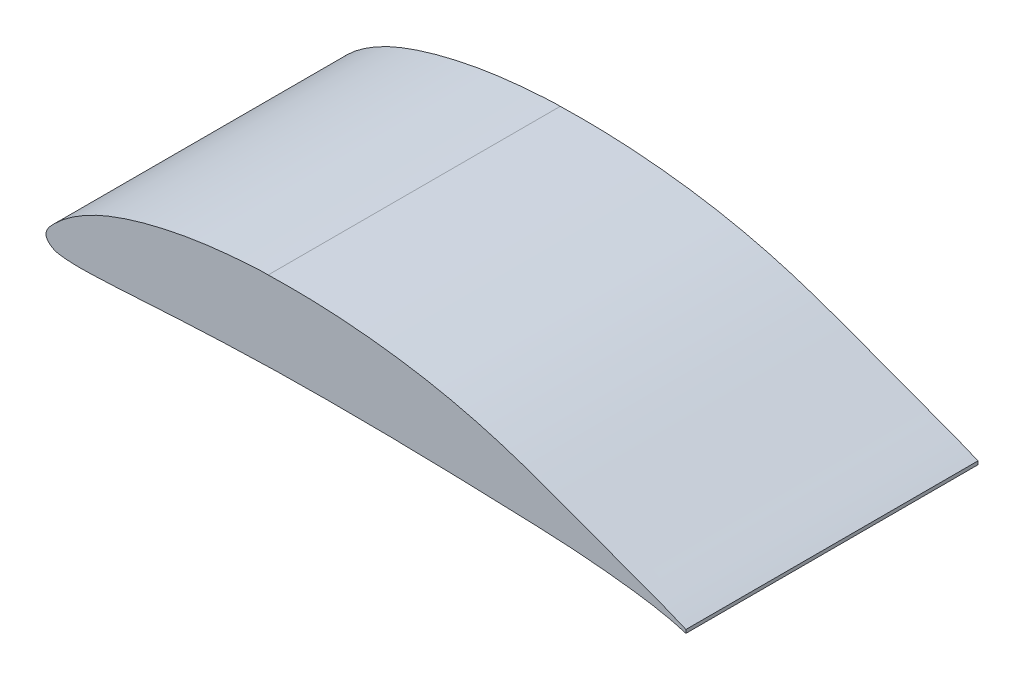
ISO-10303-21;
HEADER;
FILE_DESCRIPTION(('STEP AP214'),'2;1');
FILE_NAME('part.step','',(''),(''),'','','');
FILE_SCHEMA(('AUTOMOTIVE_DESIGN { 1 0 10303 214 1 1 1 1 }'));
ENDSEC;
DATA;
#1=APPLICATION_CONTEXT('core data for automotive mechanical design processes');
#2=APPLICATION_PROTOCOL_DEFINITION('international standard','automotive_design',2000,#1);
#3=PRODUCT_CONTEXT('',#1,'mechanical');
#4=PRODUCT('Part','Part','',(#3));
#5=PRODUCT_RELATED_PRODUCT_CATEGORY('part','',(#4));
#6=PRODUCT_DEFINITION_FORMATION('','',#4);
#7=PRODUCT_DEFINITION_CONTEXT('part definition',#1,'design');
#8=PRODUCT_DEFINITION('design','',#6,#7);
#9=PRODUCT_DEFINITION_SHAPE('','',#8);
#10=(LENGTH_UNIT() NAMED_UNIT(*) SI_UNIT(.MILLI.,.METRE.));
#11=(NAMED_UNIT(*) PLANE_ANGLE_UNIT() SI_UNIT($,.RADIAN.));
#12=(NAMED_UNIT(*) SI_UNIT($,.STERADIAN.) SOLID_ANGLE_UNIT());
#13=UNCERTAINTY_MEASURE_WITH_UNIT(LENGTH_MEASURE(1.E-05),#10,'distance_accuracy_value','');
#14=(GEOMETRIC_REPRESENTATION_CONTEXT(3) GLOBAL_UNCERTAINTY_ASSIGNED_CONTEXT((#13)) GLOBAL_UNIT_ASSIGNED_CONTEXT((#10,
#11,#12)) REPRESENTATION_CONTEXT('',''));
#15=CARTESIAN_POINT('',(0.,0.,0.));
#16=DIRECTION('',(0.,0.,1.));
#17=DIRECTION('',(1.,0.,0.));
#18=AXIS2_PLACEMENT_3D('',#15,#16,#17);
#19=CARTESIAN_POINT('',(286.055608227817,-67.2092663664544,200.));
#20=CARTESIAN_POINT('',(284.644285935263,-66.597802105307,200.));
#21=CARTESIAN_POINT('',(282.175461462593,-65.5472958097655,200.));
#22=CARTESIAN_POINT('',(278.640882202879,-64.0766875593889,200.));
#23=CARTESIAN_POINT('',(275.474642784893,-62.7903669886316,200.));
#24=CARTESIAN_POINT('',(272.312196320701,-61.5437830558965,200.));
#25=CARTESIAN_POINT('',(269.156931357705,-60.3293869088297,200.));
#26=CARTESIAN_POINT('',(265.993691800448,-59.1362769907856,200.));
#27=CARTESIAN_POINT('',(262.824387683554,-57.9585183599984,200.));
#28=CARTESIAN_POINT('',(259.650155279474,-56.7935152965214,200.));
#29=CARTESIAN_POINT('',(256.47438290546,-55.6309929065679,200.));
#30=CARTESIAN_POINT('',(252.239434164368,-54.0827408178304,200.));
#31=CARTESIAN_POINT('',(246.951126245529,-52.1365088385665,200.));
#32=CARTESIAN_POINT('',(240.614746747778,-49.7809726635527,200.));
#33=CARTESIAN_POINT('',(234.283971005091,-47.4153321021656,200.));
#34=CARTESIAN_POINT('',(227.956938485463,-45.0405089246866,200.));
#35=CARTESIAN_POINT('',(221.632362409549,-42.6583731375059,200.));
#36=CARTESIAN_POINT('',(215.306391481274,-40.2746014711487,200.));
#37=CARTESIAN_POINT('',(208.989812561505,-37.8948633020016,200.));
#38=CARTESIAN_POINT('',(202.681199965218,-35.5251997991141,200.));
#39=CARTESIAN_POINT('',(196.378289160986,-33.1767355859617,200.));
#40=CARTESIAN_POINT('',(190.065615765957,-30.8589499112433,200.));
#41=CARTESIAN_POINT('',(183.961366382459,-28.6583719657563,200.));
#42=CARTESIAN_POINT('',(179.560051762344,-27.1216651309627,200.));
#43=CARTESIAN_POINT('',(176.607497154977,-26.0993805224467,200.));
#44=CARTESIAN_POINT('',(174.25955443468,-25.311482978269,200.));
#45=CARTESIAN_POINT('',(170.186568217554,-23.9199734113576,200.));
#46=CARTESIAN_POINT('',(166.225838650053,-22.6238390862824,200.));
#47=CARTESIAN_POINT('',(161.874049685075,-21.2850022037015,200.));
#48=CARTESIAN_POINT('',(158.736648193296,-20.2914887778827,200.));
#49=CARTESIAN_POINT('',(155.066777623716,-19.2272658899611,200.));
#50=CARTESIAN_POINT('',(150.974926485595,-18.0060685962071,200.));
#51=CARTESIAN_POINT('',(145.688970990307,-16.544874514943,200.));
#52=CARTESIAN_POINT('',(139.327053916281,-14.8622977032051,200.));
#53=CARTESIAN_POINT('',(132.939676048903,-13.2769228113843,200.));
#54=CARTESIAN_POINT('',(126.529144262337,-11.7842649874989,200.));
#55=CARTESIAN_POINT('',(120.131390676028,-10.3952836219888,200.));
#56=CARTESIAN_POINT('',(113.749672511879,-9.10721305848849,200.));
#57=CARTESIAN_POINT('',(107.386282087973,-7.91870448799734,200.));
#58=CARTESIAN_POINT('',(101.007785918681,-6.82077320112415,200.));
#59=CARTESIAN_POINT('',(94.6155061161131,-5.80529502531891,200.));
#60=CARTESIAN_POINT('',(88.2098097487575,-4.87613039013865,200.));
#61=CARTESIAN_POINT('',(81.7918279452087,-4.02656267682369,200.));
#62=CARTESIAN_POINT('',(75.3763719719803,-3.25679609637486,200.));
#63=CARTESIAN_POINT('',(68.9655065698247,-2.56213242369687,200.));
#64=CARTESIAN_POINT('',(62.5611850692571,-1.94537518940381,200.));
#65=CARTESIAN_POINT('',(56.1516019302639,-1.40404015618211,200.));
#66=CARTESIAN_POINT('',(49.7366406368918,-0.939479238808299,200.));
#67=CARTESIAN_POINT('',(43.3162336950246,-0.553304168841471,200.));
#68=CARTESIAN_POINT('',(36.8904580676168,-0.244055134835146,200.));
#69=CARTESIAN_POINT('',(30.4574743318241,-0.0157190020213418,200.));
#70=CARTESIAN_POINT('',(24.0193314436082,0.134254503698745,200.));
#71=CARTESIAN_POINT('',(17.5775990832354,0.200126775617643,200.));
#72=CARTESIAN_POINT('',(9.57052206624604,0.186052888615887,200.));
#73=CARTESIAN_POINT('',(3.71239223157513,0.0371273343131518,200.));
#74=CARTESIAN_POINT('',(0.,0.,200.));
#75=B_SPLINE_CURVE_WITH_KNOTS('',3,(#19,#20,#21,#22,#23,#24,#25,#26,#27,#28,#29,#30,#31,#32,#33,
#34,#35,#36,#37,#38,#39,#40,#41,#42,#43,#44,#45,#46,#47,#48,#49,#50,#51,#52,#53,#54,#55,#56,#57,
#58,#59,#60,#61,#62,#63,#64,#65,#66,#67,#68,#69,#70,#71,#72,#73,#74),.UNSPECIFIED.,.F.,.F.,(4,1,
1,1,1,1,1,1,1,1,1,1,1,1,1,1,1,1,1,1,1,1,1,1,1,1,1,1,1,1,1,1,1,1,1,1,1,1,1,1,1,1,1,1,1,1,1,1,1,1,
1,1,1,4),(0.,0.0155663458478661,0.0271533790054014,0.0387444168495883,0.0501534358433827,
0.0615554571043646,0.0729607602409185,0.0843685956193895,0.0957736996847293,0.107181142492771,
0.118595016366418,0.14140830093972,0.164211232017684,0.187010579105938,0.209806491414266,
0.232606533582527,0.25540867608635,0.278223642013495,0.300920336848905,0.323611108079024,
0.346296668548033,0.368978321665873,0.389280515643663,0.393477088163527,0.400600192893842,
0.414344990295752,0.437037859688046,0.442772014887827,0.460424950904203,0.470341709035369,
0.481442265045974,0.503641346237949,0.525840621216428,0.548041443093927,0.57024389147018,
0.592452204863186,0.61429631720372,0.636130774921744,0.657964772913481,0.679797813110972,
0.701633713535334,0.723470751431021,0.745316507972413,0.767026058558757,0.788730770270634,
0.810430305061579,0.832124224706461,0.853822329490909,0.875524440048772,0.897230427447098,
0.918967255984546,0.940698023910348,0.962426571178589,1.),.UNSPECIFIED.);
#76=DIRECTION('',(0.,0.,-1.));
#77=VECTOR('',#76,1.);
#78=SURFACE_OF_LINEAR_EXTRUSION('',#75,#77);
#79=CARTESIAN_POINT('',(286.055608227817,-67.2092663664544,0.));
#80=CARTESIAN_POINT('',(284.644285935263,-66.597802105307,0.));
#81=CARTESIAN_POINT('',(282.175461462593,-65.5472958097655,0.));
#82=CARTESIAN_POINT('',(278.640882202879,-64.0766875593889,0.));
#83=CARTESIAN_POINT('',(275.474642784893,-62.7903669886316,0.));
#84=CARTESIAN_POINT('',(272.312196320701,-61.5437830558965,0.));
#85=CARTESIAN_POINT('',(269.156931357705,-60.3293869088297,0.));
#86=CARTESIAN_POINT('',(265.993691800448,-59.1362769907856,0.));
#87=CARTESIAN_POINT('',(262.824387683554,-57.9585183599984,0.));
#88=CARTESIAN_POINT('',(259.650155279474,-56.7935152965214,0.));
#89=CARTESIAN_POINT('',(256.47438290546,-55.6309929065679,0.));
#90=CARTESIAN_POINT('',(252.239434164368,-54.0827408178304,0.));
#91=CARTESIAN_POINT('',(246.951126245529,-52.1365088385665,0.));
#92=CARTESIAN_POINT('',(240.614746747778,-49.7809726635527,0.));
#93=CARTESIAN_POINT('',(234.283971005091,-47.4153321021656,0.));
#94=CARTESIAN_POINT('',(227.956938485463,-45.0405089246866,0.));
#95=CARTESIAN_POINT('',(221.632362409549,-42.6583731375059,0.));
#96=CARTESIAN_POINT('',(215.306391481274,-40.2746014711487,0.));
#97=CARTESIAN_POINT('',(208.989812561505,-37.8948633020016,0.));
#98=CARTESIAN_POINT('',(202.681199965218,-35.5251997991141,0.));
#99=CARTESIAN_POINT('',(196.378289160986,-33.1767355859617,0.));
#100=CARTESIAN_POINT('',(190.065615765957,-30.8589499112433,0.));
#101=CARTESIAN_POINT('',(183.961366382459,-28.6583719657563,0.));
#102=CARTESIAN_POINT('',(179.560051762344,-27.1216651309627,0.));
#103=CARTESIAN_POINT('',(176.607497154977,-26.0993805224467,0.));
#104=CARTESIAN_POINT('',(174.25955443468,-25.311482978269,0.));
#105=CARTESIAN_POINT('',(170.186568217554,-23.9199734113576,0.));
#106=CARTESIAN_POINT('',(166.225838650053,-22.6238390862824,0.));
#107=CARTESIAN_POINT('',(161.874049685075,-21.2850022037015,0.));
#108=CARTESIAN_POINT('',(158.736648193296,-20.2914887778827,0.));
#109=CARTESIAN_POINT('',(155.066777623716,-19.2272658899611,0.));
#110=CARTESIAN_POINT('',(150.974926485595,-18.0060685962071,0.));
#111=CARTESIAN_POINT('',(145.688970990307,-16.544874514943,0.));
#112=CARTESIAN_POINT('',(139.327053916281,-14.8622977032051,0.));
#113=CARTESIAN_POINT('',(132.939676048903,-13.2769228113843,0.));
#114=CARTESIAN_POINT('',(126.529144262337,-11.7842649874989,0.));
#115=CARTESIAN_POINT('',(120.131390676028,-10.3952836219888,0.));
#116=CARTESIAN_POINT('',(113.749672511879,-9.10721305848849,0.));
#117=CARTESIAN_POINT('',(107.386282087973,-7.91870448799734,0.));
#118=CARTESIAN_POINT('',(101.007785918681,-6.82077320112415,0.));
#119=CARTESIAN_POINT('',(94.6155061161131,-5.80529502531891,0.));
#120=CARTESIAN_POINT('',(88.2098097487575,-4.87613039013865,0.));
#121=CARTESIAN_POINT('',(81.7918279452087,-4.02656267682369,0.));
#122=CARTESIAN_POINT('',(75.3763719719803,-3.25679609637486,0.));
#123=CARTESIAN_POINT('',(68.9655065698247,-2.56213242369687,0.));
#124=CARTESIAN_POINT('',(62.5611850692571,-1.94537518940381,0.));
#125=CARTESIAN_POINT('',(56.1516019302639,-1.40404015618211,0.));
#126=CARTESIAN_POINT('',(49.7366406368918,-0.939479238808299,0.));
#127=CARTESIAN_POINT('',(43.3162336950246,-0.553304168841471,0.));
#128=CARTESIAN_POINT('',(36.8904580676168,-0.244055134835146,0.));
#129=CARTESIAN_POINT('',(30.4574743318241,-0.0157190020213418,0.));
#130=CARTESIAN_POINT('',(24.0193314436082,0.134254503698745,0.));
#131=CARTESIAN_POINT('',(17.5775990832354,0.200126775617643,0.));
#132=CARTESIAN_POINT('',(9.57052206624604,0.186052888615887,0.));
#133=CARTESIAN_POINT('',(3.71239223157513,0.0371273343131518,0.));
#134=CARTESIAN_POINT('',(0.,0.,0.));
#135=B_SPLINE_CURVE_WITH_KNOTS('',3,(#79,#80,#81,#82,#83,#84,#85,#86,#87,#88,#89,#90,#91,#92,
#93,#94,#95,#96,#97,#98,#99,#100,#101,#102,#103,#104,#105,#106,#107,#108,#109,#110,#111,#112,
#113,#114,#115,#116,#117,#118,#119,#120,#121,#122,#123,#124,#125,#126,#127,#128,#129,#130,#131,
#132,#133,#134),.UNSPECIFIED.,.F.,.F.,(4,1,1,1,1,1,1,1,1,1,1,1,1,1,1,1,1,1,1,1,1,1,1,1,1,1,1,1,
1,1,1,1,1,1,1,1,1,1,1,1,1,1,1,1,1,1,1,1,1,1,1,1,1,4),(0.,0.0155663458478661,0.0271533790054014,
0.0387444168495883,0.0501534358433827,0.0615554571043646,0.0729607602409185,0.0843685956193895,
0.0957736996847293,0.107181142492771,0.118595016366418,0.14140830093972,0.164211232017684,
0.187010579105938,0.209806491414266,0.232606533582527,0.25540867608635,0.278223642013495,
0.300920336848905,0.323611108079024,0.346296668548033,0.368978321665873,0.389280515643663,
0.393477088163527,0.400600192893842,0.414344990295752,0.437037859688046,0.442772014887827,
0.460424950904203,0.470341709035369,0.481442265045974,0.503641346237949,0.525840621216428,
0.548041443093927,0.57024389147018,0.592452204863186,0.61429631720372,0.636130774921744,
0.657964772913481,0.679797813110972,0.701633713535334,0.723470751431021,0.745316507972413,
0.767026058558757,0.788730770270634,0.810430305061579,0.832124224706461,0.853822329490909,
0.875524440048772,0.897230427447098,0.918967255984546,0.940698023910348,0.962426571178589,1.),.UNSPECIFIED.);
#136=CARTESIAN_POINT('',(286.055608227817,-67.2092663664544,0.));
#137=VERTEX_POINT('',#136);
#138=CARTESIAN_POINT('',(0.,0.,0.));
#139=VERTEX_POINT('',#138);
#140=EDGE_CURVE('E84',#137,#139,#135,.T.);
#141=ORIENTED_EDGE('',*,*,#140,.T.);
#142=DIRECTION('',(0.,0.,-1.));
#143=VECTOR('',#142,1.);
#144=CARTESIAN_POINT('',(0.,0.,200.));
#145=LINE('',#144,#143);
#146=CARTESIAN_POINT('',(0.,0.,200.));
#147=VERTEX_POINT('',#146);
#148=EDGE_CURVE('E11',#147,#139,#145,.T.);
#149=ORIENTED_EDGE('',*,*,#148,.F.);
#150=CARTESIAN_POINT('',(286.055608227817,-67.2092663664544,200.));
#151=VERTEX_POINT('',#150);
#152=EDGE_CURVE('E78',#151,#147,#75,.T.);
#153=ORIENTED_EDGE('',*,*,#152,.F.);
#154=DIRECTION('',(0.,0.,-1.));
#155=VECTOR('',#154,1.);
#156=CARTESIAN_POINT('',(286.055608227817,-67.2092663664544,200.));
#157=LINE('',#156,#155);
#158=EDGE_CURVE('E85',#151,#137,#157,.T.);
#159=ORIENTED_EDGE('',*,*,#158,.T.);
#160=EDGE_LOOP('',(#141,#149,#153,#159));
#161=FACE_BOUND('',#160,.T.);
#162=ADVANCED_FACE('F37',(#161),#78,.F.);
#163=CARTESIAN_POINT('',(0.,0.,200.));
#164=CARTESIAN_POINT('',(-2.72544469434858,0.164790749583422,200.));
#165=CARTESIAN_POINT('',(-6.52932909883404,-0.138331243559546,200.));
#166=CARTESIAN_POINT('',(-11.3970160176044,-0.405348511675152,200.));
#167=CARTESIAN_POINT('',(-15.7138746293244,-0.644446610318393,200.));
#168=CARTESIAN_POINT('',(-21.1219132162305,-1.04162710657494,200.));
#169=CARTESIAN_POINT('',(-27.6196486914364,-1.60292024289176,200.));
#170=CARTESIAN_POINT('',(-34.1059820356775,-2.27096479271357,200.));
#171=CARTESIAN_POINT('',(-40.5797975032374,-3.04358752510805,200.));
#172=CARTESIAN_POINT('',(-47.0382797225268,-3.93165203654491,200.));
#173=CARTESIAN_POINT('',(-53.4797342633691,-4.93595541698658,200.));
#174=CARTESIAN_POINT('',(-58.8544145842465,-5.87735676153041,200.));
#175=CARTESIAN_POINT('',(-63.1699850239338,-6.70024073990857,200.));
#176=CARTESIAN_POINT('',(-66.4344257406446,-7.35791438393813,200.));
#177=CARTESIAN_POINT('',(-69.6919639360622,-8.04633918791434,200.));
#178=CARTESIAN_POINT('',(-72.9410773212538,-8.77256441020449,200.));
#179=CARTESIAN_POINT('',(-76.1831552635823,-9.52997929871324,200.));
#180=CARTESIAN_POINT('',(-79.4172008012859,-10.3235591673397,200.));
#181=CARTESIAN_POINT('',(-82.6711886270487,-11.1617899567296,200.));
#182=CARTESIAN_POINT('',(-85.9452127495626,-12.041440016916,200.));
#183=CARTESIAN_POINT('',(-89.2363210897438,-12.9710177462046,200.));
#184=CARTESIAN_POINT('',(-92.5148276594007,-13.9418819354046,200.));
#185=CARTESIAN_POINT('',(-95.7791416098827,-14.9598563849571,200.));
#186=CARTESIAN_POINT('',(-99.028801967751,-16.0241914301425,200.));
#187=CARTESIAN_POINT('',(-102.262401726196,-17.140269432356,200.));
#188=CARTESIAN_POINT('',(-104.962526080627,-18.1216946486792,200.));
#189=CARTESIAN_POINT('',(-107.136544699351,-18.9451655751197,200.));
#190=CARTESIAN_POINT('',(-108.791541193428,-19.5894143893994,200.));
#191=CARTESIAN_POINT('',(-110.439200679393,-20.250087877796,200.));
#192=CARTESIAN_POINT('',(-112.080238251049,-20.9260166498894,200.));
#193=CARTESIAN_POINT('',(-113.436360446688,-21.5145621527157,200.));
#194=CARTESIAN_POINT('',(-114.799567501285,-22.0847442750566,200.));
#195=CARTESIAN_POINT('',(-116.429788539406,-22.8496394465016,200.));
#196=CARTESIAN_POINT('',(-118.360299467536,-23.7346284681962,200.));
#197=CARTESIAN_POINT('',(-120.291408253312,-24.6854328831868,200.));
#198=CARTESIAN_POINT('',(-121.948548065576,-25.5246585990438,200.));
#199=CARTESIAN_POINT('',(-123.593652925741,-26.3920032846504,200.));
#200=CARTESIAN_POINT('',(-125.229519218315,-27.2840160581547,200.));
#201=CARTESIAN_POINT('',(-126.855596581311,-28.2048597650844,200.));
#202=CARTESIAN_POINT('',(-128.517200827165,-29.1774154696009,200.));
#203=CARTESIAN_POINT('',(-130.210830809581,-30.2054428608264,200.));
#204=CARTESIAN_POINT('',(-131.930502415232,-31.2915582877593,200.));
#205=CARTESIAN_POINT('',(-133.628269535945,-32.4063893764687,200.));
#206=CARTESIAN_POINT('',(-135.298492235823,-33.5464998415276,200.));
#207=CARTESIAN_POINT('',(-136.932725115513,-34.7128219004775,200.));
#208=CARTESIAN_POINT('',(-138.527730346508,-35.8992508321427,200.));
#209=CARTESIAN_POINT('',(-139.87977025011,-36.956117216662,200.));
#210=CARTESIAN_POINT('',(-141.006081118248,-37.8695294979159,200.));
#211=CARTESIAN_POINT('',(-141.921591235653,-38.6374058624645,200.));
#212=CARTESIAN_POINT('',(-142.83066432285,-39.4252082169866,200.));
#213=CARTESIAN_POINT('',(-143.739703160887,-40.2392195222824,200.));
#214=CARTESIAN_POINT('',(-144.656101653298,-41.0859971142451,200.));
#215=CARTESIAN_POINT('',(-145.586401749361,-41.9716570916303,200.));
#216=CARTESIAN_POINT('',(-146.641442979399,-43.0037567410984,200.));
#217=CARTESIAN_POINT('',(-147.814027187201,-44.1864433778299,200.));
#218=CARTESIAN_POINT('',(-149.051137738408,-45.5344711746307,200.));
#219=CARTESIAN_POINT('',(-150.183287121577,-46.9377733764786,200.));
#220=CARTESIAN_POINT('',(-151.137791587594,-48.3803112990373,200.));
#221=CARTESIAN_POINT('',(-151.835733309422,-49.8540116854497,200.));
#222=CARTESIAN_POINT('',(-152.197950673143,-51.3578746251207,200.));
#223=CARTESIAN_POINT('',(-152.116377566936,-52.6851503003317,200.));
#224=CARTESIAN_POINT('',(-151.736524948699,-53.7579016921667,200.));
#225=CARTESIAN_POINT('',(-151.248705518465,-54.6228139720972,200.));
#226=CARTESIAN_POINT('',(-150.621080517088,-55.4449950815154,200.));
#227=CARTESIAN_POINT('',(-149.875697311031,-56.2108185283776,200.));
#228=CARTESIAN_POINT('',(-149.041156236584,-56.9109425539876,200.));
#229=CARTESIAN_POINT('',(-148.14140797374,-57.5317357673812,200.));
#230=CARTESIAN_POINT('',(-147.234879226667,-58.0420676744274,200.));
#231=CARTESIAN_POINT('',(-146.342332478582,-58.4465787552214,200.));
#232=CARTESIAN_POINT('',(-145.476863289611,-58.7603439455045,200.));
#233=CARTESIAN_POINT('',(-144.603345186612,-59.0092855456743,200.));
#234=CARTESIAN_POINT('',(-143.724303936116,-59.2082453007514,200.));
#235=CARTESIAN_POINT('',(-142.839292944965,-59.3635774966879,200.));
#236=CARTESIAN_POINT('',(-141.950551403222,-59.4904517006071,200.));
#237=CARTESIAN_POINT('',(-140.825929853647,-59.6224951617536,200.));
#238=CARTESIAN_POINT('',(-139.464937171847,-59.764274743453,200.));
#239=CARTESIAN_POINT('',(-137.865807953267,-59.9018404958987,200.));
#240=CARTESIAN_POINT('',(-136.262207012527,-60.012543486888,200.));
#241=CARTESIAN_POINT('',(-134.65556267396,-60.0982830219626,200.));
#242=CARTESIAN_POINT('',(-133.046632135369,-60.1614907812667,200.));
#243=CARTESIAN_POINT('',(-131.436429612872,-60.2022802418391,200.));
#244=CARTESIAN_POINT('',(-129.825050101119,-60.2235982671792,200.));
#245=CARTESIAN_POINT('',(-128.213228637502,-60.2252107223767,200.));
#246=CARTESIAN_POINT('',(-126.601727434913,-60.2114395068279,200.));
#247=CARTESIAN_POINT('',(-124.991342664132,-60.182816004504,200.));
#248=CARTESIAN_POINT('',(-123.381767086838,-60.1441704614718,200.));
#249=CARTESIAN_POINT('',(-121.772547624013,-60.0942559480151,200.));
#250=CARTESIAN_POINT('',(-120.163299382264,-60.0396223390406,200.));
#251=CARTESIAN_POINT('',(-118.553272856305,-59.9787438204824,200.));
#252=CARTESIAN_POINT('',(-116.405135774567,-59.897052050928,200.));
#253=CARTESIAN_POINT('',(-114.25630744021,-59.8095632990556,200.));
#254=CARTESIAN_POINT('',(-112.107687844983,-59.7183053614698,200.));
#255=CARTESIAN_POINT('',(-110.496074248895,-59.6460155959153,200.));
#256=CARTESIAN_POINT('',(-108.884224595953,-59.5730156611318,200.));
#257=CARTESIAN_POINT('',(-106.733902853936,-59.4685209424002,200.));
#258=CARTESIAN_POINT('',(-104.045134478544,-59.3330585655456,200.));
#259=CARTESIAN_POINT('',(-100.818867527399,-59.1580403819959,200.));
#260=CARTESIAN_POINT('',(-97.5935315031166,-58.9743179758917,200.));
#261=CARTESIAN_POINT('',(-94.3689550042216,-58.7831367558273,200.));
#262=CARTESIAN_POINT('',(-91.1444894259803,-58.5882614449545,200.));
#263=CARTESIAN_POINT('',(-87.9195491073137,-58.391747611325,200.));
#264=CARTESIAN_POINT('',(-84.6943539554334,-58.1934006407241,200.));
#265=CARTESIAN_POINT('',(-81.4686828336534,-57.9985546727506,200.));
#266=CARTESIAN_POINT('',(-78.2435704183729,-57.803396431559,200.));
#267=CARTESIAN_POINT('',(-75.0184688106671,-57.6120701759964,200.));
#268=CARTESIAN_POINT('',(-71.7935691375863,-57.4230925645896,200.));
#269=CARTESIAN_POINT('',(-68.5680021645788,-57.2394511838037,200.));
#270=CARTESIAN_POINT('',(-65.342134171509,-57.0558734159147,200.));
#271=CARTESIAN_POINT('',(-60.8896896545785,-56.8119680847767,200.));
#272=CARTESIAN_POINT('',(-50.4823717002852,-56.2567971713271,200.));
#273=CARTESIAN_POINT('',(-39.7380248067957,-55.7608687515293,200.));
#274=CARTESIAN_POINT('',(-29.1456083143517,-55.3180800657323,200.));
#275=CARTESIAN_POINT('',(-23.436100513826,-55.1001441625481,200.));
#276=CARTESIAN_POINT('',(-16.9890968811141,-54.8711937166516,200.));
#277=CARTESIAN_POINT('',(-10.5445310589956,-54.6675233602613,200.));
#278=CARTESIAN_POINT('',(-5.21614159634649,-54.5116005861344,200.));
#279=CARTESIAN_POINT('',(24.8162053738212,-53.7511666198252,200.));
#280=CARTESIAN_POINT('',(54.8640632605243,-53.7858286358131,200.));
#281=CARTESIAN_POINT('',(86.0077491535619,-54.1717055042567,200.));
#282=CARTESIAN_POINT('',(92.4373985609915,-54.2674477371324,200.));
#283=CARTESIAN_POINT('',(98.8660424529147,-54.3779660378944,200.));
#284=CARTESIAN_POINT('',(104.734565572241,-54.492454462783,200.));
#285=CARTESIAN_POINT('',(115.492942114854,-54.7248260006576,200.));
#286=CARTESIAN_POINT('',(126.206565517297,-55.0005154222873,200.));
#287=CARTESIAN_POINT('',(137.477971798704,-55.3334913782424,200.));
#288=CARTESIAN_POINT('',(143.859380275635,-55.5310565641997,200.));
#289=CARTESIAN_POINT('',(149.213526008542,-55.7020969113367,200.));
#290=CARTESIAN_POINT('',(153.497044421685,-55.8457134532995,200.));
#291=CARTESIAN_POINT('',(156.069039561091,-55.9299778966188,200.));
#292=CARTESIAN_POINT('',(159.282488984272,-56.0397767095879,200.));
#293=CARTESIAN_POINT('',(163.567567313871,-56.1843726475899,200.));
#294=CARTESIAN_POINT('',(169.564265612151,-56.3927467775649,200.));
#295=CARTESIAN_POINT('',(175.989918575756,-56.624585829574,200.));
#296=CARTESIAN_POINT('',(182.413470776628,-56.8748690300332,200.));
#297=CARTESIAN_POINT('',(188.835284324909,-57.1505005234359,200.));
#298=CARTESIAN_POINT('',(195.255523834182,-57.4559594434146,200.));
#299=CARTESIAN_POINT('',(201.67468868919,-57.8025754626158,200.));
#300=CARTESIAN_POINT('',(208.095271976033,-58.1948285100056,200.));
#301=CARTESIAN_POINT('',(214.515615190576,-58.6400935643211,200.));
#302=CARTESIAN_POINT('',(220.933950248024,-59.1450858909558,200.));
#303=CARTESIAN_POINT('',(227.347072377983,-59.7063200617567,200.));
#304=CARTESIAN_POINT('',(233.754357612506,-60.336125959504,200.));
#305=CARTESIAN_POINT('',(240.156440818072,-61.0304507631749,200.));
#306=CARTESIAN_POINT('',(246.552866019501,-61.7990036801624,200.));
#307=CARTESIAN_POINT('',(251.884892916227,-62.5035284556997,200.));
#308=CARTESIAN_POINT('',(256.155563709151,-63.1069807322569,200.));
#309=CARTESIAN_POINT('',(259.366061644844,-63.5886037697631,200.));
#310=CARTESIAN_POINT('',(262.570233843336,-64.10283595409,200.));
#311=CARTESIAN_POINT('',(265.766684956026,-64.655259055404,200.));
#312=CARTESIAN_POINT('',(268.953024844875,-65.2550257360165,200.));
#313=CARTESIAN_POINT('',(272.128277639047,-65.9070778349096,200.));
#314=CARTESIAN_POINT('',(275.311127882879,-66.6227576013525,200.));
#315=CARTESIAN_POINT('',(278.499849812672,-67.4068724108746,200.));
#316=CARTESIAN_POINT('',(282.090484330269,-68.3716723854666,200.));
#317=CARTESIAN_POINT('',(284.615229936587,-69.0618473187342,200.));
#318=CARTESIAN_POINT('',(286.055608227816,-69.5327669476352,200.));
#319=B_SPLINE_CURVE_WITH_KNOTS('',3,(#163,#164,#165,#166,#167,#168,#169,#170,#171,#172,#173,
#174,#175,#176,#177,#178,#179,#180,#181,#182,#183,#184,#185,#186,#187,#188,#189,#190,#191,#192,
#193,#194,#195,#196,#197,#198,#199,#200,#201,#202,#203,#204,#205,#206,#207,#208,#209,#210,#211,
#212,#213,#214,#215,#216,#217,#218,#219,#220,#221,#222,#223,#224,#225,#226,#227,#228,#229,#230,
#231,#232,#233,#234,#235,#236,#237,#238,#239,#240,#241,#242,#243,#244,#245,#246,#247,#248,#249,
#250,#251,#252,#253,#254,#255,#256,#257,#258,#259,#260,#261,#262,#263,#264,#265,#266,#267,#268,
#269,#270,#271,#272,#273,#274,#275,#276,#277,#278,#279,#280,#281,#282,#283,#284,#285,#286,#287,
#288,#289,#290,#291,#292,#293,#294,#295,#296,#297,#298,#299,#300,#301,#302,#303,#304,#305,#306,
#307,#308,#309,#310,#311,#312,#313,#314,#315,#316,#317,#318),.UNSPECIFIED.,.F.,.F.,(4,1,1,1,1,1,
1,1,1,1,1,1,1,1,1,1,1,1,1,1,1,1,1,1,1,1,1,1,1,1,1,1,1,1,1,1,1,1,1,1,1,1,1,1,1,1,1,1,1,1,1,1,1,1,
1,1,1,1,1,1,1,1,1,1,1,1,1,1,1,1,1,1,1,1,1,1,1,1,1,1,1,1,1,1,1,1,1,1,1,1,1,1,1,1,1,1,1,1,1,1,1,1,
1,1,1,1,1,1,1,1,1,1,1,1,1,1,1,1,1,1,1,1,1,1,1,1,1,1,1,1,1,1,1,1,1,1,1,1,1,1,1,1,1,1,1,1,1,1,1,1,
1,1,1,4),(0.,0.0134292659065423,0.018716728610188,0.0240041913138337,0.0347060789088175,
0.0454050560701035,0.0561027301278355,0.0667979789512791,0.0774925363136409,0.0881874681652888,
0.0988828876135847,0.104346572131986,0.109810220441929,0.115272402230658,0.120733355661961,
0.126196005558347,0.131658688713517,0.137122535551242,0.142734055551014,0.148343908032164,
0.153954022475119,0.159562373957581,0.165172764502703,0.170783601436258,0.176398137637409,
0.179312147988322,0.182225445180424,0.185138958093783,0.188049197439952,0.190960187679375,
0.192414974363068,0.195321254444893,0.199821328464623,0.20286738539964,0.205914523260288,
0.208963571129132,0.21202028936229,0.21508481773682,0.218160636947103,0.221495946565638,
0.224835492234463,0.228170770380033,0.231492006984737,0.234787968655468,0.23805182539943,
0.241275187026522,0.243233432569819,0.245188894866361,0.247155988591931,0.249153783456915,
0.251194382758889,0.253296820231377,0.255475442558074,0.258458464543895,0.261492957595136,
0.264476844309163,0.267324325906974,0.269987634761977,0.272465074306775,0.274860745999124,
0.276409009225178,0.278031413620584,0.279729107799822,0.281486083888106,0.283280709907735,
0.285082354757615,0.286858663999512,0.288393504711582,0.289900317796843,0.291385352464174,
0.292861116420468,0.294334247118463,0.295806563612168,0.29727913510716,0.299907182651896,
0.30254107327006,0.305178379934564,0.307818240380049,0.310459635883087,0.313103075215547,
0.315745668788915,0.318391033365397,0.321035996519733,0.323677343110393,0.326318212757937,
0.328960244039422,0.331601385290138,0.334243176134954,0.336890139181699,0.342181747609557,
0.344828040464028,0.347474761996695,0.350121774360477,0.352769380489897,0.358070712496644,
0.363372139953354,0.368671762454401,0.373970917176379,0.379270748412431,0.384570920920053,
0.389872896419319,0.395174529747671,0.400475992743844,0.405775315840564,0.411075767392514,
0.416375554698386,0.42167664528008,0.426978554783708,0.43832248067336,0.472972246356973,
0.479915503672184,0.490501855129104,0.501093744604714,0.511666366568934,0.522236564654131,
0.527330212594801,0.659527063693772,0.6700779619264,0.680626483596464,0.691175965906203,
0.701723186171883,0.709515689763829,0.744138976794753,0.754470581402603,0.765015593889479,
0.775562087595432,0.780836091731661,0.786110095867895,0.788227743852922,0.796661302899548,
0.807212434039641,0.81776015140972,0.828307694234507,0.838851850589839,0.849396097947553,
0.859942465706293,0.870491530346271,0.881055601712766,0.891617635486437,0.902178562962712,
0.912739889927393,0.923304471745332,0.933872558413238,0.944447572394691,0.949775125093398,
0.955100631011814,0.960425594342214,0.965746938330823,0.971065681072529,0.976382903913223,
0.981700185725844,0.987121329541633,0.992543080786545,1.),.UNSPECIFIED.);
#320=DIRECTION('',(0.,0.,-1.));
#321=VECTOR('',#320,1.);
#322=SURFACE_OF_LINEAR_EXTRUSION('',#319,#321);
#323=CARTESIAN_POINT('',(0.,0.,0.));
#324=CARTESIAN_POINT('',(-2.72544469434858,0.164790749583422,0.));
#325=CARTESIAN_POINT('',(-6.52932909883404,-0.138331243559546,0.));
#326=CARTESIAN_POINT('',(-11.3970160176044,-0.405348511675152,0.));
#327=CARTESIAN_POINT('',(-15.7138746293244,-0.644446610318393,0.));
#328=CARTESIAN_POINT('',(-21.1219132162305,-1.04162710657494,0.));
#329=CARTESIAN_POINT('',(-27.6196486914364,-1.60292024289176,0.));
#330=CARTESIAN_POINT('',(-34.1059820356775,-2.27096479271357,0.));
#331=CARTESIAN_POINT('',(-40.5797975032374,-3.04358752510805,0.));
#332=CARTESIAN_POINT('',(-47.0382797225268,-3.93165203654491,0.));
#333=CARTESIAN_POINT('',(-53.4797342633691,-4.93595541698658,0.));
#334=CARTESIAN_POINT('',(-58.8544145842465,-5.87735676153041,0.));
#335=CARTESIAN_POINT('',(-63.1699850239338,-6.70024073990857,0.));
#336=CARTESIAN_POINT('',(-66.4344257406446,-7.35791438393813,0.));
#337=CARTESIAN_POINT('',(-69.6919639360622,-8.04633918791434,0.));
#338=CARTESIAN_POINT('',(-72.9410773212538,-8.77256441020449,0.));
#339=CARTESIAN_POINT('',(-76.1831552635823,-9.52997929871324,0.));
#340=CARTESIAN_POINT('',(-79.4172008012859,-10.3235591673397,0.));
#341=CARTESIAN_POINT('',(-82.6711886270487,-11.1617899567296,0.));
#342=CARTESIAN_POINT('',(-85.9452127495626,-12.041440016916,0.));
#343=CARTESIAN_POINT('',(-89.2363210897438,-12.9710177462046,0.));
#344=CARTESIAN_POINT('',(-92.5148276594007,-13.9418819354046,0.));
#345=CARTESIAN_POINT('',(-95.7791416098827,-14.9598563849571,0.));
#346=CARTESIAN_POINT('',(-99.028801967751,-16.0241914301425,0.));
#347=CARTESIAN_POINT('',(-102.262401726196,-17.140269432356,0.));
#348=CARTESIAN_POINT('',(-104.962526080627,-18.1216946486792,0.));
#349=CARTESIAN_POINT('',(-107.136544699351,-18.9451655751197,0.));
#350=CARTESIAN_POINT('',(-108.791541193428,-19.5894143893994,0.));
#351=CARTESIAN_POINT('',(-110.439200679393,-20.250087877796,0.));
#352=CARTESIAN_POINT('',(-112.080238251049,-20.9260166498894,0.));
#353=CARTESIAN_POINT('',(-113.436360446688,-21.5145621527157,0.));
#354=CARTESIAN_POINT('',(-114.799567501285,-22.0847442750566,0.));
#355=CARTESIAN_POINT('',(-116.429788539406,-22.8496394465016,0.));
#356=CARTESIAN_POINT('',(-118.360299467536,-23.7346284681962,0.));
#357=CARTESIAN_POINT('',(-120.291408253312,-24.6854328831868,0.));
#358=CARTESIAN_POINT('',(-121.948548065576,-25.5246585990438,0.));
#359=CARTESIAN_POINT('',(-123.593652925741,-26.3920032846504,0.));
#360=CARTESIAN_POINT('',(-125.229519218315,-27.2840160581547,0.));
#361=CARTESIAN_POINT('',(-126.855596581311,-28.2048597650844,0.));
#362=CARTESIAN_POINT('',(-128.517200827165,-29.1774154696009,0.));
#363=CARTESIAN_POINT('',(-130.210830809581,-30.2054428608264,0.));
#364=CARTESIAN_POINT('',(-131.930502415232,-31.2915582877593,0.));
#365=CARTESIAN_POINT('',(-133.628269535945,-32.4063893764687,0.));
#366=CARTESIAN_POINT('',(-135.298492235823,-33.5464998415276,0.));
#367=CARTESIAN_POINT('',(-136.932725115513,-34.7128219004775,0.));
#368=CARTESIAN_POINT('',(-138.527730346508,-35.8992508321427,0.));
#369=CARTESIAN_POINT('',(-139.87977025011,-36.956117216662,0.));
#370=CARTESIAN_POINT('',(-141.006081118248,-37.8695294979159,0.));
#371=CARTESIAN_POINT('',(-141.921591235653,-38.6374058624645,0.));
#372=CARTESIAN_POINT('',(-142.83066432285,-39.4252082169866,0.));
#373=CARTESIAN_POINT('',(-143.739703160887,-40.2392195222824,0.));
#374=CARTESIAN_POINT('',(-144.656101653298,-41.0859971142451,0.));
#375=CARTESIAN_POINT('',(-145.586401749361,-41.9716570916303,0.));
#376=CARTESIAN_POINT('',(-146.641442979399,-43.0037567410984,0.));
#377=CARTESIAN_POINT('',(-147.814027187201,-44.1864433778299,0.));
#378=CARTESIAN_POINT('',(-149.051137738408,-45.5344711746307,0.));
#379=CARTESIAN_POINT('',(-150.183287121577,-46.9377733764786,0.));
#380=CARTESIAN_POINT('',(-151.137791587594,-48.3803112990373,0.));
#381=CARTESIAN_POINT('',(-151.835733309422,-49.8540116854497,0.));
#382=CARTESIAN_POINT('',(-152.197950673143,-51.3578746251207,0.));
#383=CARTESIAN_POINT('',(-152.116377566936,-52.6851503003317,0.));
#384=CARTESIAN_POINT('',(-151.736524948699,-53.7579016921667,0.));
#385=CARTESIAN_POINT('',(-151.248705518465,-54.6228139720972,0.));
#386=CARTESIAN_POINT('',(-150.621080517088,-55.4449950815154,0.));
#387=CARTESIAN_POINT('',(-149.875697311031,-56.2108185283776,0.));
#388=CARTESIAN_POINT('',(-149.041156236584,-56.9109425539876,0.));
#389=CARTESIAN_POINT('',(-148.14140797374,-57.5317357673812,0.));
#390=CARTESIAN_POINT('',(-147.234879226667,-58.0420676744274,0.));
#391=CARTESIAN_POINT('',(-146.342332478582,-58.4465787552214,0.));
#392=CARTESIAN_POINT('',(-145.476863289611,-58.7603439455045,0.));
#393=CARTESIAN_POINT('',(-144.603345186612,-59.0092855456743,0.));
#394=CARTESIAN_POINT('',(-143.724303936116,-59.2082453007514,0.));
#395=CARTESIAN_POINT('',(-142.839292944965,-59.3635774966879,0.));
#396=CARTESIAN_POINT('',(-141.950551403222,-59.4904517006071,0.));
#397=CARTESIAN_POINT('',(-140.825929853647,-59.6224951617536,0.));
#398=CARTESIAN_POINT('',(-139.464937171847,-59.764274743453,0.));
#399=CARTESIAN_POINT('',(-137.865807953267,-59.9018404958987,0.));
#400=CARTESIAN_POINT('',(-136.262207012527,-60.012543486888,0.));
#401=CARTESIAN_POINT('',(-134.65556267396,-60.0982830219626,0.));
#402=CARTESIAN_POINT('',(-133.046632135369,-60.1614907812667,0.));
#403=CARTESIAN_POINT('',(-131.436429612872,-60.2022802418391,0.));
#404=CARTESIAN_POINT('',(-129.825050101119,-60.2235982671792,0.));
#405=CARTESIAN_POINT('',(-128.213228637502,-60.2252107223767,0.));
#406=CARTESIAN_POINT('',(-126.601727434913,-60.2114395068279,0.));
#407=CARTESIAN_POINT('',(-124.991342664132,-60.182816004504,0.));
#408=CARTESIAN_POINT('',(-123.381767086838,-60.1441704614718,0.));
#409=CARTESIAN_POINT('',(-121.772547624013,-60.0942559480151,0.));
#410=CARTESIAN_POINT('',(-120.163299382264,-60.0396223390406,0.));
#411=CARTESIAN_POINT('',(-118.553272856305,-59.9787438204824,0.));
#412=CARTESIAN_POINT('',(-116.405135774567,-59.897052050928,0.));
#413=CARTESIAN_POINT('',(-114.25630744021,-59.8095632990556,0.));
#414=CARTESIAN_POINT('',(-112.107687844983,-59.7183053614698,0.));
#415=CARTESIAN_POINT('',(-110.496074248895,-59.6460155959153,0.));
#416=CARTESIAN_POINT('',(-108.884224595953,-59.5730156611318,0.));
#417=CARTESIAN_POINT('',(-106.733902853936,-59.4685209424002,0.));
#418=CARTESIAN_POINT('',(-104.045134478544,-59.3330585655456,0.));
#419=CARTESIAN_POINT('',(-100.818867527399,-59.1580403819959,0.));
#420=CARTESIAN_POINT('',(-97.5935315031166,-58.9743179758917,0.));
#421=CARTESIAN_POINT('',(-94.3689550042216,-58.7831367558273,0.));
#422=CARTESIAN_POINT('',(-91.1444894259803,-58.5882614449545,0.));
#423=CARTESIAN_POINT('',(-87.9195491073137,-58.391747611325,0.));
#424=CARTESIAN_POINT('',(-84.6943539554334,-58.1934006407241,0.));
#425=CARTESIAN_POINT('',(-81.4686828336534,-57.9985546727506,0.));
#426=CARTESIAN_POINT('',(-78.2435704183729,-57.803396431559,0.));
#427=CARTESIAN_POINT('',(-75.0184688106671,-57.6120701759964,0.));
#428=CARTESIAN_POINT('',(-71.7935691375863,-57.4230925645896,0.));
#429=CARTESIAN_POINT('',(-68.5680021645788,-57.2394511838037,0.));
#430=CARTESIAN_POINT('',(-65.342134171509,-57.0558734159147,0.));
#431=CARTESIAN_POINT('',(-60.8896896545785,-56.8119680847767,0.));
#432=CARTESIAN_POINT('',(-50.4823717002852,-56.2567971713271,0.));
#433=CARTESIAN_POINT('',(-39.7380248067957,-55.7608687515293,0.));
#434=CARTESIAN_POINT('',(-29.1456083143517,-55.3180800657323,0.));
#435=CARTESIAN_POINT('',(-23.436100513826,-55.1001441625481,0.));
#436=CARTESIAN_POINT('',(-16.9890968811141,-54.8711937166516,0.));
#437=CARTESIAN_POINT('',(-10.5445310589956,-54.6675233602613,0.));
#438=CARTESIAN_POINT('',(-5.21614159634649,-54.5116005861344,0.));
#439=CARTESIAN_POINT('',(24.8162053738212,-53.7511666198252,0.));
#440=CARTESIAN_POINT('',(54.8640632605243,-53.7858286358131,0.));
#441=CARTESIAN_POINT('',(86.0077491535619,-54.1717055042567,0.));
#442=CARTESIAN_POINT('',(92.4373985609915,-54.2674477371324,0.));
#443=CARTESIAN_POINT('',(98.8660424529147,-54.3779660378944,0.));
#444=CARTESIAN_POINT('',(104.734565572241,-54.492454462783,0.));
#445=CARTESIAN_POINT('',(115.492942114854,-54.7248260006576,0.));
#446=CARTESIAN_POINT('',(126.206565517297,-55.0005154222873,0.));
#447=CARTESIAN_POINT('',(137.477971798704,-55.3334913782424,0.));
#448=CARTESIAN_POINT('',(143.859380275635,-55.5310565641997,0.));
#449=CARTESIAN_POINT('',(149.213526008542,-55.7020969113367,0.));
#450=CARTESIAN_POINT('',(153.497044421685,-55.8457134532995,0.));
#451=CARTESIAN_POINT('',(156.069039561091,-55.9299778966188,0.));
#452=CARTESIAN_POINT('',(159.282488984272,-56.0397767095879,0.));
#453=CARTESIAN_POINT('',(163.567567313871,-56.1843726475899,0.));
#454=CARTESIAN_POINT('',(169.564265612151,-56.3927467775649,0.));
#455=CARTESIAN_POINT('',(175.989918575756,-56.624585829574,0.));
#456=CARTESIAN_POINT('',(182.413470776628,-56.8748690300332,0.));
#457=CARTESIAN_POINT('',(188.835284324909,-57.1505005234359,0.));
#458=CARTESIAN_POINT('',(195.255523834182,-57.4559594434146,0.));
#459=CARTESIAN_POINT('',(201.67468868919,-57.8025754626158,0.));
#460=CARTESIAN_POINT('',(208.095271976033,-58.1948285100056,0.));
#461=CARTESIAN_POINT('',(214.515615190576,-58.6400935643211,0.));
#462=CARTESIAN_POINT('',(220.933950248024,-59.1450858909558,0.));
#463=CARTESIAN_POINT('',(227.347072377983,-59.7063200617567,0.));
#464=CARTESIAN_POINT('',(233.754357612506,-60.336125959504,0.));
#465=CARTESIAN_POINT('',(240.156440818072,-61.0304507631749,0.));
#466=CARTESIAN_POINT('',(246.552866019501,-61.7990036801624,0.));
#467=CARTESIAN_POINT('',(251.884892916227,-62.5035284556997,0.));
#468=CARTESIAN_POINT('',(256.155563709151,-63.1069807322569,0.));
#469=CARTESIAN_POINT('',(259.366061644844,-63.5886037697631,0.));
#470=CARTESIAN_POINT('',(262.570233843336,-64.10283595409,0.));
#471=CARTESIAN_POINT('',(265.766684956026,-64.655259055404,0.));
#472=CARTESIAN_POINT('',(268.953024844875,-65.2550257360165,0.));
#473=CARTESIAN_POINT('',(272.128277639047,-65.9070778349096,0.));
#474=CARTESIAN_POINT('',(275.311127882879,-66.6227576013525,0.));
#475=CARTESIAN_POINT('',(278.499849812672,-67.4068724108746,0.));
#476=CARTESIAN_POINT('',(282.090484330269,-68.3716723854666,0.));
#477=CARTESIAN_POINT('',(284.615229936587,-69.0618473187342,0.));
#478=CARTESIAN_POINT('',(286.055608227816,-69.5327669476352,0.));
#479=B_SPLINE_CURVE_WITH_KNOTS('',3,(#323,#324,#325,#326,#327,#328,#329,#330,#331,#332,#333,
#334,#335,#336,#337,#338,#339,#340,#341,#342,#343,#344,#345,#346,#347,#348,#349,#350,#351,#352,
#353,#354,#355,#356,#357,#358,#359,#360,#361,#362,#363,#364,#365,#366,#367,#368,#369,#370,#371,
#372,#373,#374,#375,#376,#377,#378,#379,#380,#381,#382,#383,#384,#385,#386,#387,#388,#389,#390,
#391,#392,#393,#394,#395,#396,#397,#398,#399,#400,#401,#402,#403,#404,#405,#406,#407,#408,#409,
#410,#411,#412,#413,#414,#415,#416,#417,#418,#419,#420,#421,#422,#423,#424,#425,#426,#427,#428,
#429,#430,#431,#432,#433,#434,#435,#436,#437,#438,#439,#440,#441,#442,#443,#444,#445,#446,#447,
#448,#449,#450,#451,#452,#453,#454,#455,#456,#457,#458,#459,#460,#461,#462,#463,#464,#465,#466,
#467,#468,#469,#470,#471,#472,#473,#474,#475,#476,#477,#478),.UNSPECIFIED.,.F.,.F.,(4,1,1,1,1,1,
1,1,1,1,1,1,1,1,1,1,1,1,1,1,1,1,1,1,1,1,1,1,1,1,1,1,1,1,1,1,1,1,1,1,1,1,1,1,1,1,1,1,1,1,1,1,1,1,
1,1,1,1,1,1,1,1,1,1,1,1,1,1,1,1,1,1,1,1,1,1,1,1,1,1,1,1,1,1,1,1,1,1,1,1,1,1,1,1,1,1,1,1,1,1,1,1,
1,1,1,1,1,1,1,1,1,1,1,1,1,1,1,1,1,1,1,1,1,1,1,1,1,1,1,1,1,1,1,1,1,1,1,1,1,1,1,1,1,1,1,1,1,1,1,1,
1,1,1,4),(0.,0.0134292659065423,0.018716728610188,0.0240041913138337,0.0347060789088175,
0.0454050560701035,0.0561027301278355,0.0667979789512791,0.0774925363136409,0.0881874681652888,
0.0988828876135847,0.104346572131986,0.109810220441929,0.115272402230658,0.120733355661961,
0.126196005558347,0.131658688713517,0.137122535551242,0.142734055551014,0.148343908032164,
0.153954022475119,0.159562373957581,0.165172764502703,0.170783601436258,0.176398137637409,
0.179312147988322,0.182225445180424,0.185138958093783,0.188049197439952,0.190960187679375,
0.192414974363068,0.195321254444893,0.199821328464623,0.20286738539964,0.205914523260288,
0.208963571129132,0.21202028936229,0.21508481773682,0.218160636947103,0.221495946565638,
0.224835492234463,0.228170770380033,0.231492006984737,0.234787968655468,0.23805182539943,
0.241275187026522,0.243233432569819,0.245188894866361,0.247155988591931,0.249153783456915,
0.251194382758889,0.253296820231377,0.255475442558074,0.258458464543895,0.261492957595136,
0.264476844309163,0.267324325906974,0.269987634761977,0.272465074306775,0.274860745999124,
0.276409009225178,0.278031413620584,0.279729107799822,0.281486083888106,0.283280709907735,
0.285082354757615,0.286858663999512,0.288393504711582,0.289900317796843,0.291385352464174,
0.292861116420468,0.294334247118463,0.295806563612168,0.29727913510716,0.299907182651896,
0.30254107327006,0.305178379934564,0.307818240380049,0.310459635883087,0.313103075215547,
0.315745668788915,0.318391033365397,0.321035996519733,0.323677343110393,0.326318212757937,
0.328960244039422,0.331601385290138,0.334243176134954,0.336890139181699,0.342181747609557,
0.344828040464028,0.347474761996695,0.350121774360477,0.352769380489897,0.358070712496644,
0.363372139953354,0.368671762454401,0.373970917176379,0.379270748412431,0.384570920920053,
0.389872896419319,0.395174529747671,0.400475992743844,0.405775315840564,0.411075767392514,
0.416375554698386,0.42167664528008,0.426978554783708,0.43832248067336,0.472972246356973,
0.479915503672184,0.490501855129104,0.501093744604714,0.511666366568934,0.522236564654131,
0.527330212594801,0.659527063693772,0.6700779619264,0.680626483596464,0.691175965906203,
0.701723186171883,0.709515689763829,0.744138976794753,0.754470581402603,0.765015593889479,
0.775562087595432,0.780836091731661,0.786110095867895,0.788227743852922,0.796661302899548,
0.807212434039641,0.81776015140972,0.828307694234507,0.838851850589839,0.849396097947553,
0.859942465706293,0.870491530346271,0.881055601712766,0.891617635486437,0.902178562962712,
0.912739889927393,0.923304471745332,0.933872558413238,0.944447572394691,0.949775125093398,
0.955100631011814,0.960425594342214,0.965746938330823,0.971065681072529,0.976382903913223,
0.981700185725844,0.987121329541633,0.992543080786545,1.),.UNSPECIFIED.);
#480=CARTESIAN_POINT('',(286.055608227816,-69.5327669476352,0.));
#481=VERTEX_POINT('',#480);
#482=EDGE_CURVE('E66',#139,#481,#479,.T.);
#483=ORIENTED_EDGE('',*,*,#482,.T.);
#484=DIRECTION('',(0.,0.,-1.));
#485=VECTOR('',#484,1.);
#486=CARTESIAN_POINT('',(286.055608227816,-69.5327669476352,200.));
#487=LINE('',#486,#485);
#488=CARTESIAN_POINT('',(286.055608227816,-69.5327669476352,200.));
#489=VERTEX_POINT('',#488);
#490=EDGE_CURVE('E46',#489,#481,#487,.T.);
#491=ORIENTED_EDGE('',*,*,#490,.F.);
#492=EDGE_CURVE('E74',#147,#489,#319,.T.);
#493=ORIENTED_EDGE('',*,*,#492,.F.);
#494=ORIENTED_EDGE('',*,*,#148,.T.);
#495=EDGE_LOOP('',(#483,#491,#493,#494));
#496=FACE_BOUND('',#495,.T.);
#497=ADVANCED_FACE('F75',(#496),#322,.F.);
#498=CARTESIAN_POINT('',(286.055608227817,-67.2092663664544,200.));
#499=DIRECTION('',(-1.,1.91129373259878E-13,0.));
#500=DIRECTION('',(-1.91129373259878E-13,-1.,0.));
#501=AXIS2_PLACEMENT_3D('',#498,#499,#500);
#502=PLANE('',#501);
#503=DIRECTION('',(1.91129373259878E-13,1.,0.));
#504=VECTOR('',#503,1.);
#505=CARTESIAN_POINT('',(286.055608227817,-67.2092663664544,0.));
#506=LINE('',#505,#504);
#507=EDGE_CURVE('E71',#481,#137,#506,.T.);
#508=ORIENTED_EDGE('',*,*,#507,.T.);
#509=ORIENTED_EDGE('',*,*,#158,.F.);
#510=DIRECTION('',(1.91129373259878E-13,1.,0.));
#511=VECTOR('',#510,1.);
#512=CARTESIAN_POINT('',(286.055608227817,-67.2092663664544,200.));
#513=LINE('',#512,#511);
#514=EDGE_CURVE('E54',#489,#151,#513,.T.);
#515=ORIENTED_EDGE('',*,*,#514,.F.);
#516=ORIENTED_EDGE('',*,*,#490,.T.);
#517=EDGE_LOOP('',(#508,#509,#515,#516));
#518=FACE_BOUND('',#517,.T.);
#519=ADVANCED_FACE('F102',(#518),#502,.F.);
#520=CARTESIAN_POINT('',(146.727582175115,-16.839517573516,200.));
#521=DIRECTION('',(0.,0.,-1.));
#522=DIRECTION('',(-1.,0.,0.));
#523=AXIS2_PLACEMENT_3D('',#520,#521,#522);
#524=PLANE('',#523);
#525=ORIENTED_EDGE('',*,*,#152,.T.);
#526=ORIENTED_EDGE('',*,*,#492,.T.);
#527=ORIENTED_EDGE('',*,*,#514,.T.);
#528=EDGE_LOOP('',(#525,#526,#527));
#529=FACE_BOUND('',#528,.T.);
#530=ADVANCED_FACE('F81',(#529),#524,.F.);
#531=CARTESIAN_POINT('',(146.727582175115,-16.839517573516,0.));
#532=DIRECTION('',(0.,0.,-1.));
#533=DIRECTION('',(-1.,0.,0.));
#534=AXIS2_PLACEMENT_3D('',#531,#532,#533);
#535=PLANE('',#534);
#536=ORIENTED_EDGE('',*,*,#140,.F.);
#537=ORIENTED_EDGE('',*,*,#507,.F.);
#538=ORIENTED_EDGE('',*,*,#482,.F.);
#539=EDGE_LOOP('',(#536,#537,#538));
#540=FACE_BOUND('',#539,.T.);
#541=ADVANCED_FACE('F103',(#540),#535,.T.);
#542=CLOSED_SHELL('',(#162,#497,#519,#530,#541));
#543=MANIFOLD_SOLID_BREP('B2',#542);
#544=ADVANCED_BREP_SHAPE_REPRESENTATION('',(#18,#543),#14);
#545=SHAPE_DEFINITION_REPRESENTATION(#9,#544);
ENDSEC;
END-ISO-10303-21;
